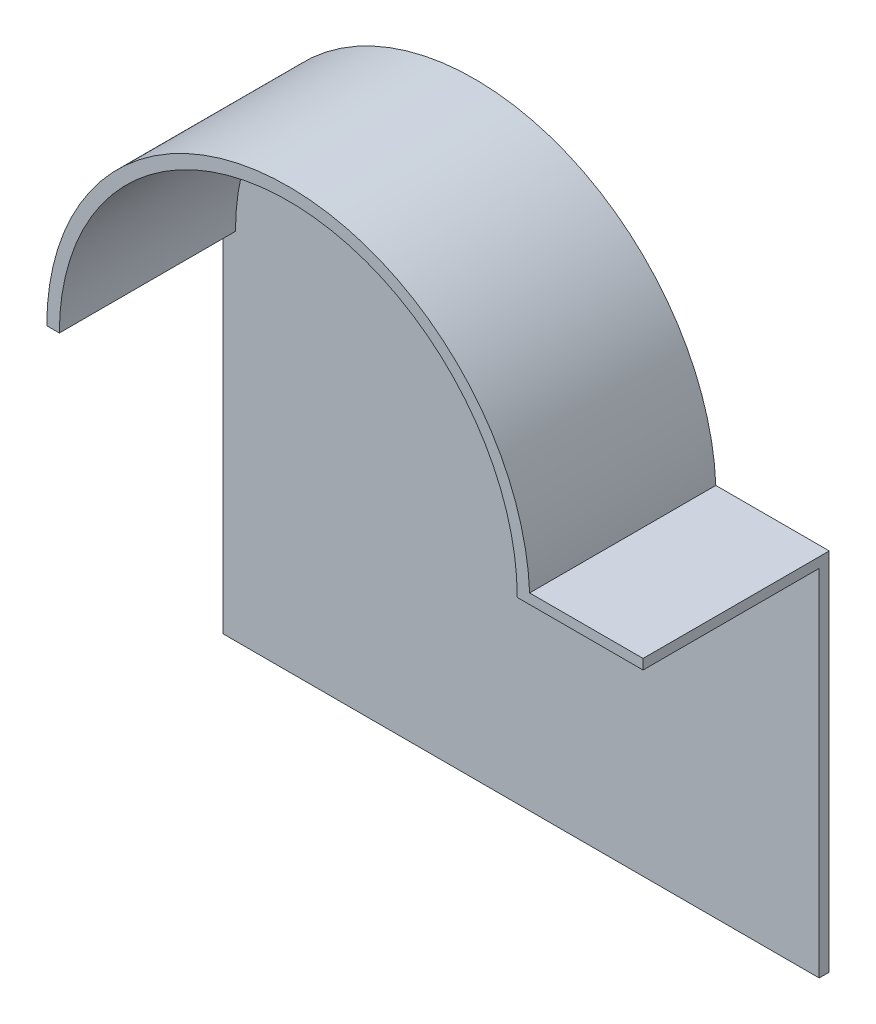
ISO-10303-21;
HEADER;
FILE_DESCRIPTION(('STEP AP214'),'2;1');
FILE_NAME('part.step','',(''),(''),'','','');
FILE_SCHEMA(('AUTOMOTIVE_DESIGN { 1 0 10303 214 1 1 1 1 }'));
ENDSEC;
DATA;
#1=APPLICATION_CONTEXT('core data for automotive mechanical design processes');
#2=APPLICATION_PROTOCOL_DEFINITION('international standard','automotive_design',2000,#1);
#3=PRODUCT_CONTEXT('',#1,'mechanical');
#4=PRODUCT('Part','Part','',(#3));
#5=PRODUCT_RELATED_PRODUCT_CATEGORY('part','',(#4));
#6=PRODUCT_DEFINITION_FORMATION('','',#4);
#7=PRODUCT_DEFINITION_CONTEXT('part definition',#1,'design');
#8=PRODUCT_DEFINITION('design','',#6,#7);
#9=PRODUCT_DEFINITION_SHAPE('','',#8);
#10=(LENGTH_UNIT() NAMED_UNIT(*) SI_UNIT(.MILLI.,.METRE.));
#11=(NAMED_UNIT(*) PLANE_ANGLE_UNIT() SI_UNIT($,.RADIAN.));
#12=(NAMED_UNIT(*) SI_UNIT($,.STERADIAN.) SOLID_ANGLE_UNIT());
#13=UNCERTAINTY_MEASURE_WITH_UNIT(LENGTH_MEASURE(1.E-05),#10,'distance_accuracy_value','');
#14=(GEOMETRIC_REPRESENTATION_CONTEXT(3) GLOBAL_UNCERTAINTY_ASSIGNED_CONTEXT((#13)) GLOBAL_UNIT_ASSIGNED_CONTEXT((#10,
#11,#12)) REPRESENTATION_CONTEXT('',''));
#15=CARTESIAN_POINT('',(0.,0.,0.));
#16=DIRECTION('',(0.,0.,1.));
#17=DIRECTION('',(1.,0.,0.));
#18=AXIS2_PLACEMENT_3D('',#15,#16,#17);
#19=CARTESIAN_POINT('',(0.,0.,2.));
#20=DIRECTION('',(0.,0.,-1.));
#21=DIRECTION('',(-1.,0.,0.));
#22=AXIS2_PLACEMENT_3D('',#19,#20,#21);
#23=PLANE('',#22);
#24=DIRECTION('',(1.,0.,0.));
#25=VECTOR('',#24,1.);
#26=CARTESIAN_POINT('',(-45.5,0.,2.));
#27=LINE('',#26,#25);
#28=CARTESIAN_POINT('',(-48.,0.,2.));
#29=VERTEX_POINT('',#28);
#30=CARTESIAN_POINT('',(-45.5,0.,2.));
#31=VERTEX_POINT('',#30);
#32=EDGE_CURVE('E175',#29,#31,#27,.T.);
#33=ORIENTED_EDGE('',*,*,#32,.F.);
#34=DIRECTION('',(0.,-1.,0.));
#35=VECTOR('',#34,1.);
#36=CARTESIAN_POINT('',(-48.,0.,2.));
#37=LINE('',#36,#35);
#38=CARTESIAN_POINT('',(-48.,-70.5,2.));
#39=VERTEX_POINT('',#38);
#40=EDGE_CURVE('E168',#29,#39,#37,.T.);
#41=ORIENTED_EDGE('',*,*,#40,.T.);
#42=DIRECTION('',(1.,0.,0.));
#43=VECTOR('',#42,1.);
#44=CARTESIAN_POINT('',(-48.,-70.5,2.));
#45=LINE('',#44,#43);
#46=CARTESIAN_POINT('',(70.5,-70.5,2.));
#47=VERTEX_POINT('',#46);
#48=EDGE_CURVE('E147',#39,#47,#45,.T.);
#49=ORIENTED_EDGE('',*,*,#48,.T.);
#50=DIRECTION('',(0.,1.,0.));
#51=VECTOR('',#50,1.);
#52=CARTESIAN_POINT('',(70.5,-68.,2.));
#53=LINE('',#52,#51);
#54=CARTESIAN_POINT('',(70.5,0.,2.));
#55=VERTEX_POINT('',#54);
#56=EDGE_CURVE('E143',#47,#55,#53,.T.);
#57=ORIENTED_EDGE('',*,*,#56,.T.);
#58=DIRECTION('',(-1.,0.,0.));
#59=VECTOR('',#58,1.);
#60=CARTESIAN_POINT('',(68.,0.,2.));
#61=LINE('',#60,#59);
#62=CARTESIAN_POINT('',(45.5,0.,2.));
#63=VERTEX_POINT('',#62);
#64=EDGE_CURVE('E165',#55,#63,#61,.T.);
#65=ORIENTED_EDGE('',*,*,#64,.T.);
#66=CARTESIAN_POINT('',(0.,0.,2.));
#67=DIRECTION('',(0.,0.,-1.));
#68=DIRECTION('',(1.,0.,0.));
#69=AXIS2_PLACEMENT_3D('',#66,#67,#68);
#70=CIRCLE('',#69,45.5);
#71=EDGE_CURVE('E63',#31,#63,#70,.T.);
#72=ORIENTED_EDGE('',*,*,#71,.F.);
#73=EDGE_LOOP('',(#33,#41,#49,#57,#65,#72));
#74=FACE_BOUND('',#73,.T.);
#75=ADVANCED_FACE('F39',(#74),#23,.F.);
#76=CARTESIAN_POINT('',(70.5,0.,2.));
#77=DIRECTION('',(-1.,0.,0.));
#78=DIRECTION('',(0.,-1.,0.));
#79=AXIS2_PLACEMENT_3D('',#76,#77,#78);
#80=PLANE('',#79);
#81=DIRECTION('',(0.,1.,0.));
#82=VECTOR('',#81,1.);
#83=CARTESIAN_POINT('',(70.5,0.,0.));
#84=LINE('',#83,#82);
#85=CARTESIAN_POINT('',(70.5,-70.5,0.));
#86=VERTEX_POINT('',#85);
#87=CARTESIAN_POINT('',(70.5,2.00000000000001,0.));
#88=VERTEX_POINT('',#87);
#89=EDGE_CURVE('E130',#86,#88,#84,.T.);
#90=ORIENTED_EDGE('',*,*,#89,.T.);
#91=DIRECTION('',(0.,0.,1.));
#92=VECTOR('',#91,1.);
#93=CARTESIAN_POINT('',(70.5,2.00000000000001,0.));
#94=LINE('',#93,#92);
#95=CARTESIAN_POINT('',(70.5,2.00000000000001,37.));
#96=VERTEX_POINT('',#95);
#97=EDGE_CURVE('E110',#88,#96,#94,.T.);
#98=ORIENTED_EDGE('',*,*,#97,.T.);
#99=DIRECTION('',(0.,-1.,0.));
#100=VECTOR('',#99,1.);
#101=CARTESIAN_POINT('',(70.5,0.,37.));
#102=LINE('',#101,#100);
#103=CARTESIAN_POINT('',(70.5,0.,37.));
#104=VERTEX_POINT('',#103);
#105=EDGE_CURVE('E211',#96,#104,#102,.T.);
#106=ORIENTED_EDGE('',*,*,#105,.T.);
#107=DIRECTION('',(0.,0.,-1.));
#108=VECTOR('',#107,1.);
#109=CARTESIAN_POINT('',(70.5,0.,0.));
#110=LINE('',#109,#108);
#111=EDGE_CURVE('E163',#104,#55,#110,.T.);
#112=ORIENTED_EDGE('',*,*,#111,.T.);
#113=ORIENTED_EDGE('',*,*,#56,.F.);
#114=DIRECTION('',(0.,0.,-1.));
#115=VECTOR('',#114,1.);
#116=CARTESIAN_POINT('',(70.5,-70.5,2.));
#117=LINE('',#116,#115);
#118=EDGE_CURVE('E144',#47,#86,#117,.T.);
#119=ORIENTED_EDGE('',*,*,#118,.T.);
#120=EDGE_LOOP('',(#90,#98,#106,#112,#113,#119));
#121=FACE_BOUND('',#120,.T.);
#122=ADVANCED_FACE('F41',(#121),#80,.F.);
#123=CARTESIAN_POINT('',(0.,0.,2.));
#124=DIRECTION('',(0.,0.,-1.));
#125=DIRECTION('',(-1.,0.,0.));
#126=AXIS2_PLACEMENT_3D('',#123,#124,#125);
#127=CYLINDRICAL_SURFACE('',#126,48.);
#128=CARTESIAN_POINT('',(0.,0.,37.));
#129=DIRECTION('',(0.,0.,1.));
#130=DIRECTION('',(1.,0.,0.));
#131=AXIS2_PLACEMENT_3D('',#128,#129,#130);
#132=CIRCLE('',#131,48.);
#133=CARTESIAN_POINT('',(47.9583152331272,2.00000000000001,37.));
#134=VERTEX_POINT('',#133);
#135=CARTESIAN_POINT('',(-48.,0.,37.));
#136=VERTEX_POINT('',#135);
#137=EDGE_CURVE('E122',#134,#136,#132,.T.);
#138=ORIENTED_EDGE('',*,*,#137,.F.);
#139=DIRECTION('',(0.,0.,-1.));
#140=VECTOR('',#139,1.);
#141=CARTESIAN_POINT('',(47.9583152331272,2.00000000000001,2.));
#142=LINE('',#141,#140);
#143=CARTESIAN_POINT('',(47.9583152331272,2.00000000000001,0.));
#144=VERTEX_POINT('',#143);
#145=EDGE_CURVE('E55',#144,#134,#142,.F.);
#146=ORIENTED_EDGE('',*,*,#145,.F.);
#147=CARTESIAN_POINT('',(0.,0.,0.));
#148=DIRECTION('',(0.,0.,1.));
#149=DIRECTION('',(-1.,0.,0.));
#150=AXIS2_PLACEMENT_3D('',#147,#148,#149);
#151=CIRCLE('',#150,48.);
#152=CARTESIAN_POINT('',(-48.,0.,0.));
#153=VERTEX_POINT('',#152);
#154=EDGE_CURVE('E119',#144,#153,#151,.T.);
#155=ORIENTED_EDGE('',*,*,#154,.T.);
#156=DIRECTION('',(0.,0.,-1.));
#157=VECTOR('',#156,1.);
#158=CARTESIAN_POINT('',(-48.,0.,2.));
#159=LINE('',#158,#157);
#160=EDGE_CURVE('E11',#29,#153,#159,.T.);
#161=ORIENTED_EDGE('',*,*,#160,.F.);
#162=DIRECTION('',(0.,0.,-1.));
#163=VECTOR('',#162,1.);
#164=CARTESIAN_POINT('',(-48.,0.,37.));
#165=LINE('',#164,#163);
#166=EDGE_CURVE('E180',#136,#29,#165,.T.);
#167=ORIENTED_EDGE('',*,*,#166,.F.);
#168=EDGE_LOOP('',(#138,#146,#155,#161,#167));
#169=FACE_BOUND('',#168,.T.);
#170=ADVANCED_FACE('F117',(#169),#127,.T.);
#171=CARTESIAN_POINT('',(-48.,-68.,2.));
#172=DIRECTION('',(1.,0.,0.));
#173=DIRECTION('',(0.,0.,-1.));
#174=AXIS2_PLACEMENT_3D('',#171,#172,#173);
#175=PLANE('',#174);
#176=DIRECTION('',(0.,-1.,0.));
#177=VECTOR('',#176,1.);
#178=CARTESIAN_POINT('',(-48.,-68.,0.));
#179=LINE('',#178,#177);
#180=CARTESIAN_POINT('',(-48.,-70.5,0.));
#181=VERTEX_POINT('',#180);
#182=EDGE_CURVE('E128',#153,#181,#179,.T.);
#183=ORIENTED_EDGE('',*,*,#182,.T.);
#184=DIRECTION('',(0.,0.,-1.));
#185=VECTOR('',#184,1.);
#186=CARTESIAN_POINT('',(-48.,-70.5,2.));
#187=LINE('',#186,#185);
#188=EDGE_CURVE('E48',#39,#181,#187,.T.);
#189=ORIENTED_EDGE('',*,*,#188,.F.);
#190=ORIENTED_EDGE('',*,*,#40,.F.);
#191=ORIENTED_EDGE('',*,*,#160,.T.);
#192=EDGE_LOOP('',(#183,#189,#190,#191));
#193=FACE_BOUND('',#192,.T.);
#194=ADVANCED_FACE('F177',(#193),#175,.F.);
#195=CARTESIAN_POINT('',(-48.,-70.5,2.));
#196=DIRECTION('',(0.,1.,0.));
#197=DIRECTION('',(0.,0.,1.));
#198=AXIS2_PLACEMENT_3D('',#195,#196,#197);
#199=PLANE('',#198);
#200=DIRECTION('',(1.,0.,0.));
#201=VECTOR('',#200,1.);
#202=CARTESIAN_POINT('',(-48.,-70.5,0.));
#203=LINE('',#202,#201);
#204=EDGE_CURVE('E134',#181,#86,#203,.T.);
#205=ORIENTED_EDGE('',*,*,#204,.T.);
#206=ORIENTED_EDGE('',*,*,#118,.F.);
#207=ORIENTED_EDGE('',*,*,#48,.F.);
#208=ORIENTED_EDGE('',*,*,#188,.T.);
#209=EDGE_LOOP('',(#205,#206,#207,#208));
#210=FACE_BOUND('',#209,.T.);
#211=ADVANCED_FACE('F153',(#210),#199,.F.);
#212=CARTESIAN_POINT('',(0.,0.,0.));
#213=DIRECTION('',(0.,0.,-1.));
#214=DIRECTION('',(-1.,0.,0.));
#215=AXIS2_PLACEMENT_3D('',#212,#213,#214);
#216=PLANE('',#215);
#217=ORIENTED_EDGE('',*,*,#89,.F.);
#218=ORIENTED_EDGE('',*,*,#204,.F.);
#219=ORIENTED_EDGE('',*,*,#182,.F.);
#220=ORIENTED_EDGE('',*,*,#154,.F.);
#221=DIRECTION('',(1.,0.,0.));
#222=VECTOR('',#221,1.);
#223=CARTESIAN_POINT('',(-48.001,1.99999999999999,0.));
#224=LINE('',#223,#222);
#225=EDGE_CURVE('E107',#144,#88,#224,.T.);
#226=ORIENTED_EDGE('',*,*,#225,.T.);
#227=EDGE_LOOP('',(#217,#218,#219,#220,#226));
#228=FACE_BOUND('',#227,.T.);
#229=ADVANCED_FACE('F126',(#228),#216,.T.);
#230=CARTESIAN_POINT('',(0.,0.,37.));
#231=DIRECTION('',(0.,0.,-1.));
#232=DIRECTION('',(-1.,0.,0.));
#233=AXIS2_PLACEMENT_3D('',#230,#231,#232);
#234=CYLINDRICAL_SURFACE('',#233,45.5);
#235=ORIENTED_EDGE('',*,*,#71,.T.);
#236=DIRECTION('',(0.,0.,-1.));
#237=VECTOR('',#236,1.);
#238=CARTESIAN_POINT('',(45.5,0.,37.));
#239=LINE('',#238,#237);
#240=CARTESIAN_POINT('',(45.5,0.,37.));
#241=VERTEX_POINT('',#240);
#242=EDGE_CURVE('E136',#241,#63,#239,.T.);
#243=ORIENTED_EDGE('',*,*,#242,.F.);
#244=CARTESIAN_POINT('',(0.,0.,37.));
#245=DIRECTION('',(0.,0.,-1.));
#246=DIRECTION('',(1.,0.,0.));
#247=AXIS2_PLACEMENT_3D('',#244,#245,#246);
#248=CIRCLE('',#247,45.5);
#249=CARTESIAN_POINT('',(-45.5,0.,37.));
#250=VERTEX_POINT('',#249);
#251=EDGE_CURVE('E194',#250,#241,#248,.T.);
#252=ORIENTED_EDGE('',*,*,#251,.F.);
#253=DIRECTION('',(0.,0.,-1.));
#254=VECTOR('',#253,1.);
#255=CARTESIAN_POINT('',(-45.5,0.,37.));
#256=LINE('',#255,#254);
#257=EDGE_CURVE('E186',#250,#31,#256,.T.);
#258=ORIENTED_EDGE('',*,*,#257,.T.);
#259=EDGE_LOOP('',(#235,#243,#252,#258));
#260=FACE_BOUND('',#259,.T.);
#261=ADVANCED_FACE('F222',(#260),#234,.F.);
#262=CARTESIAN_POINT('',(45.5,0.,37.));
#263=DIRECTION('',(0.,1.,0.));
#264=DIRECTION('',(-1.,0.,0.));
#265=AXIS2_PLACEMENT_3D('',#262,#263,#264);
#266=PLANE('',#265);
#267=ORIENTED_EDGE('',*,*,#242,.T.);
#268=ORIENTED_EDGE('',*,*,#64,.F.);
#269=ORIENTED_EDGE('',*,*,#111,.F.);
#270=DIRECTION('',(1.,0.,0.));
#271=VECTOR('',#270,1.);
#272=CARTESIAN_POINT('',(45.5,0.,37.));
#273=LINE('',#272,#271);
#274=EDGE_CURVE('E201',#241,#104,#273,.T.);
#275=ORIENTED_EDGE('',*,*,#274,.F.);
#276=EDGE_LOOP('',(#267,#268,#269,#275));
#277=FACE_BOUND('',#276,.T.);
#278=ADVANCED_FACE('F218',(#277),#266,.F.);
#279=CARTESIAN_POINT('',(-45.5,0.,37.));
#280=DIRECTION('',(0.,1.,0.));
#281=DIRECTION('',(0.,0.,1.));
#282=AXIS2_PLACEMENT_3D('',#279,#280,#281);
#283=PLANE('',#282);
#284=ORIENTED_EDGE('',*,*,#32,.T.);
#285=ORIENTED_EDGE('',*,*,#257,.F.);
#286=DIRECTION('',(1.,0.,0.));
#287=VECTOR('',#286,1.);
#288=CARTESIAN_POINT('',(-45.5,0.,37.));
#289=LINE('',#288,#287);
#290=EDGE_CURVE('E184',#136,#250,#289,.T.);
#291=ORIENTED_EDGE('',*,*,#290,.F.);
#292=ORIENTED_EDGE('',*,*,#166,.T.);
#293=EDGE_LOOP('',(#284,#285,#291,#292));
#294=FACE_BOUND('',#293,.T.);
#295=ADVANCED_FACE('F181',(#294),#283,.F.);
#296=CARTESIAN_POINT('',(0.,0.,37.));
#297=DIRECTION('',(0.,0.,1.));
#298=DIRECTION('',(1.,0.,0.));
#299=AXIS2_PLACEMENT_3D('',#296,#297,#298);
#300=PLANE('',#299);
#301=ORIENTED_EDGE('',*,*,#251,.T.);
#302=ORIENTED_EDGE('',*,*,#274,.T.);
#303=ORIENTED_EDGE('',*,*,#105,.F.);
#304=DIRECTION('',(1.,0.,0.));
#305=VECTOR('',#304,1.);
#306=CARTESIAN_POINT('',(-48.001,1.99999999999999,37.));
#307=LINE('',#306,#305);
#308=EDGE_CURVE('E124',#134,#96,#307,.T.);
#309=ORIENTED_EDGE('',*,*,#308,.F.);
#310=ORIENTED_EDGE('',*,*,#137,.T.);
#311=ORIENTED_EDGE('',*,*,#290,.T.);
#312=EDGE_LOOP('',(#301,#302,#303,#309,#310,#311));
#313=FACE_BOUND('',#312,.T.);
#314=ADVANCED_FACE('F223',(#313),#300,.T.);
#315=CARTESIAN_POINT('',(-48.001,1.99999999999999,0.));
#316=DIRECTION('',(0.,1.,0.));
#317=DIRECTION('',(-1.,0.,0.));
#318=AXIS2_PLACEMENT_3D('',#315,#316,#317);
#319=PLANE('',#318);
#320=ORIENTED_EDGE('',*,*,#225,.F.);
#321=ORIENTED_EDGE('',*,*,#145,.T.);
#322=ORIENTED_EDGE('',*,*,#308,.T.);
#323=ORIENTED_EDGE('',*,*,#97,.F.);
#324=EDGE_LOOP('',(#320,#321,#322,#323));
#325=FACE_BOUND('',#324,.T.);
#326=ADVANCED_FACE('F108',(#325),#319,.T.);
#327=CLOSED_SHELL('',(#75,#122,#170,#194,#211,#229,#261,#278,#295,#314,#326));
#328=MANIFOLD_SOLID_BREP('B2',#327);
#329=ADVANCED_BREP_SHAPE_REPRESENTATION('',(#18,#328),#14);
#330=SHAPE_DEFINITION_REPRESENTATION(#9,#329);
ENDSEC;
END-ISO-10303-21;
